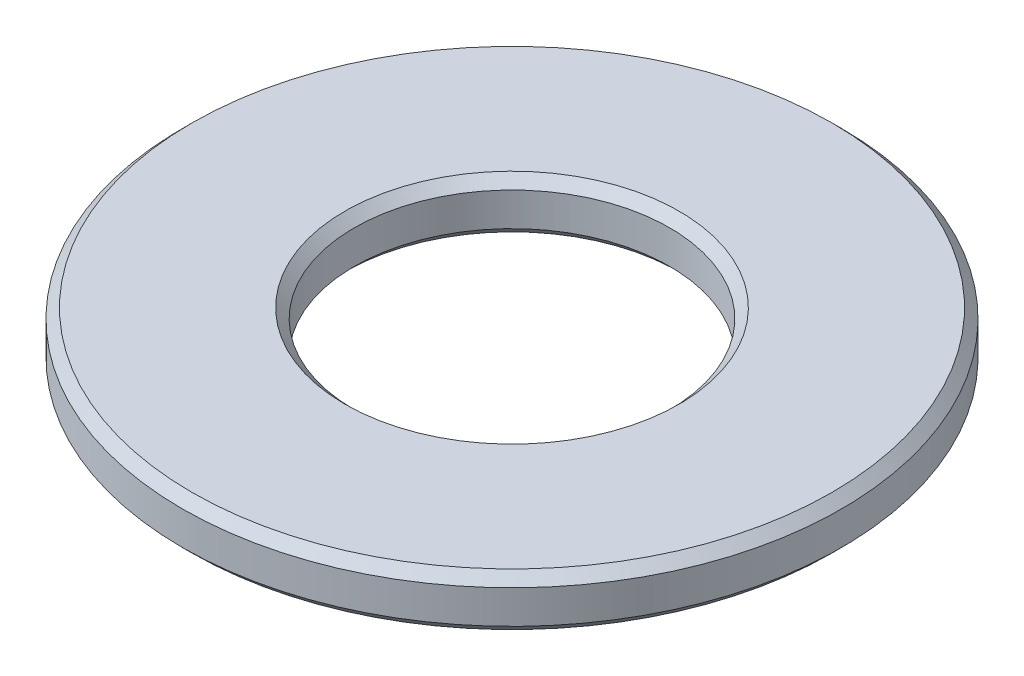
ISO-10303-21;
HEADER;
FILE_DESCRIPTION(('STEP AP214'),'2;1');
FILE_NAME('part.step','',(''),(''),'','','');
FILE_SCHEMA(('AUTOMOTIVE_DESIGN { 1 0 10303 214 1 1 1 1 }'));
ENDSEC;
DATA;
#1=APPLICATION_CONTEXT('core data for automotive mechanical design processes');
#2=APPLICATION_PROTOCOL_DEFINITION('international standard','automotive_design',2000,#1);
#3=PRODUCT_CONTEXT('',#1,'mechanical');
#4=PRODUCT('Part','Part','',(#3));
#5=PRODUCT_RELATED_PRODUCT_CATEGORY('part','',(#4));
#6=PRODUCT_DEFINITION_FORMATION('','',#4);
#7=PRODUCT_DEFINITION_CONTEXT('part definition',#1,'design');
#8=PRODUCT_DEFINITION('design','',#6,#7);
#9=PRODUCT_DEFINITION_SHAPE('','',#8);
#10=(LENGTH_UNIT() NAMED_UNIT(*) SI_UNIT(.MILLI.,.METRE.));
#11=(NAMED_UNIT(*) PLANE_ANGLE_UNIT() SI_UNIT($,.RADIAN.));
#12=(NAMED_UNIT(*) SI_UNIT($,.STERADIAN.) SOLID_ANGLE_UNIT());
#13=UNCERTAINTY_MEASURE_WITH_UNIT(LENGTH_MEASURE(1.E-05),#10,'distance_accuracy_value','');
#14=(GEOMETRIC_REPRESENTATION_CONTEXT(3) GLOBAL_UNCERTAINTY_ASSIGNED_CONTEXT((#13)) GLOBAL_UNIT_ASSIGNED_CONTEXT((#10,
#11,#12)) REPRESENTATION_CONTEXT('',''));
#15=CARTESIAN_POINT('',(0.,0.,0.));
#16=DIRECTION('',(0.,0.,1.));
#17=DIRECTION('',(1.,0.,0.));
#18=AXIS2_PLACEMENT_3D('',#15,#16,#17);
#19=CARTESIAN_POINT('',(0.,0.55,0.));
#20=DIRECTION('',(0.,1.,0.));
#21=DIRECTION('',(0.,0.,1.));
#22=AXIS2_PLACEMENT_3D('',#19,#20,#21);
#23=PLANE('',#22);
#24=CARTESIAN_POINT('',(0.,0.55,0.));
#25=DIRECTION('',(0.,1.,0.));
#26=DIRECTION('',(0.,0.,1.));
#27=AXIS2_PLACEMENT_3D('',#24,#25,#26);
#28=CIRCLE('',#27,3.35);
#29=CARTESIAN_POINT('',(0.,0.55,3.35));
#30=VERTEX_POINT('',#29);
#31=EDGE_CURVE('E58',#30,#30,#28,.T.);
#32=ORIENTED_EDGE('',*,*,#31,.T.);
#33=EDGE_LOOP('',(#32));
#34=FACE_BOUND('',#33,.T.);
#35=CARTESIAN_POINT('',(0.,0.55,0.));
#36=DIRECTION('',(0.,1.,0.));
#37=DIRECTION('',(0.,0.,1.));
#38=AXIS2_PLACEMENT_3D('',#35,#36,#37);
#39=CIRCLE('',#38,1.75);
#40=CARTESIAN_POINT('',(0.,0.55,1.75));
#41=VERTEX_POINT('',#40);
#42=EDGE_CURVE('E61',#41,#41,#39,.F.);
#43=ORIENTED_EDGE('',*,*,#42,.T.);
#44=EDGE_LOOP('',(#43));
#45=FACE_BOUND('',#44,.T.);
#46=ADVANCED_FACE('F32',(#34,#45),#23,.T.);
#47=CARTESIAN_POINT('',(0.,0.,0.));
#48=DIRECTION('',(0.,1.,0.));
#49=DIRECTION('',(0.,0.,1.));
#50=AXIS2_PLACEMENT_3D('',#47,#48,#49);
#51=PLANE('',#50);
#52=CARTESIAN_POINT('',(0.,0.,0.));
#53=DIRECTION('',(0.,1.,0.));
#54=DIRECTION('',(0.,0.,1.));
#55=AXIS2_PLACEMENT_3D('',#52,#53,#54);
#56=CIRCLE('',#55,3.35);
#57=CARTESIAN_POINT('',(0.,0.,3.35));
#58=VERTEX_POINT('',#57);
#59=EDGE_CURVE('E43',#58,#58,#56,.F.);
#60=ORIENTED_EDGE('',*,*,#59,.T.);
#61=EDGE_LOOP('',(#60));
#62=FACE_BOUND('',#61,.T.);
#63=CARTESIAN_POINT('',(0.,0.,0.));
#64=DIRECTION('',(0.,1.,0.));
#65=DIRECTION('',(0.,0.,1.));
#66=AXIS2_PLACEMENT_3D('',#63,#64,#65);
#67=CIRCLE('',#66,1.75);
#68=CARTESIAN_POINT('',(0.,0.,1.75));
#69=VERTEX_POINT('',#68);
#70=EDGE_CURVE('E47',#69,#69,#67,.T.);
#71=ORIENTED_EDGE('',*,*,#70,.T.);
#72=EDGE_LOOP('',(#71));
#73=FACE_BOUND('',#72,.T.);
#74=ADVANCED_FACE('F79',(#62,#73),#51,.F.);
#75=CARTESIAN_POINT('',(0.,0.55,0.));
#76=DIRECTION('',(0.,-1.,0.));
#77=DIRECTION('',(0.,0.,-1.));
#78=AXIS2_PLACEMENT_3D('',#75,#76,#77);
#79=CYLINDRICAL_SURFACE('',#78,3.45);
#80=CARTESIAN_POINT('',(0.,0.45,0.));
#81=DIRECTION('',(0.,1.,0.));
#82=DIRECTION('',(0.,0.,1.));
#83=AXIS2_PLACEMENT_3D('',#80,#81,#82);
#84=CIRCLE('',#83,3.45);
#85=CARTESIAN_POINT('',(0.,0.45,3.45));
#86=VERTEX_POINT('',#85);
#87=EDGE_CURVE('E52',#86,#86,#84,.F.);
#88=ORIENTED_EDGE('',*,*,#87,.T.);
#89=EDGE_LOOP('',(#88));
#90=FACE_BOUND('',#89,.T.);
#91=CARTESIAN_POINT('',(0.,0.0999999999999985,0.));
#92=DIRECTION('',(0.,1.,0.));
#93=DIRECTION('',(0.,0.,1.));
#94=AXIS2_PLACEMENT_3D('',#91,#92,#93);
#95=CIRCLE('',#94,3.45);
#96=CARTESIAN_POINT('',(0.,0.0999999999999985,3.45));
#97=VERTEX_POINT('',#96);
#98=EDGE_CURVE('E55',#97,#97,#95,.T.);
#99=ORIENTED_EDGE('',*,*,#98,.T.);
#100=EDGE_LOOP('',(#99));
#101=FACE_BOUND('',#100,.T.);
#102=ADVANCED_FACE('F85',(#90,#101),#79,.T.);
#103=CARTESIAN_POINT('',(0.,0.55,0.));
#104=DIRECTION('',(0.,-1.,0.));
#105=DIRECTION('',(0.,0.,-1.));
#106=AXIS2_PLACEMENT_3D('',#103,#104,#105);
#107=CYLINDRICAL_SURFACE('',#106,1.65);
#108=CARTESIAN_POINT('',(0.,0.45,0.));
#109=DIRECTION('',(0.,1.,0.));
#110=DIRECTION('',(0.,0.,1.));
#111=AXIS2_PLACEMENT_3D('',#108,#109,#110);
#112=CIRCLE('',#111,1.65);
#113=CARTESIAN_POINT('',(0.,0.45,1.65));
#114=VERTEX_POINT('',#113);
#115=EDGE_CURVE('E10',#114,#114,#112,.T.);
#116=ORIENTED_EDGE('',*,*,#115,.T.);
#117=EDGE_LOOP('',(#116));
#118=FACE_BOUND('',#117,.T.);
#119=CARTESIAN_POINT('',(0.,0.1,0.));
#120=DIRECTION('',(0.,1.,0.));
#121=DIRECTION('',(0.,0.,1.));
#122=AXIS2_PLACEMENT_3D('',#119,#120,#121);
#123=CIRCLE('',#122,1.65);
#124=CARTESIAN_POINT('',(0.,0.1,1.65));
#125=VERTEX_POINT('',#124);
#126=EDGE_CURVE('E39',#125,#125,#123,.F.);
#127=ORIENTED_EDGE('',*,*,#126,.T.);
#128=EDGE_LOOP('',(#127));
#129=FACE_BOUND('',#128,.T.);
#130=ADVANCED_FACE('F89',(#118,#129),#107,.F.);
#131=CARTESIAN_POINT('',(0.,0.55,0.));
#132=DIRECTION('',(0.,-1.,0.));
#133=DIRECTION('',(0.,0.,-1.));
#134=AXIS2_PLACEMENT_3D('',#131,#132,#133);
#135=CONICAL_SURFACE('',#134,3.35,0.785398163397435);
#136=ORIENTED_EDGE('',*,*,#87,.F.);
#137=EDGE_LOOP('',(#136));
#138=FACE_BOUND('',#137,.T.);
#139=ORIENTED_EDGE('',*,*,#31,.F.);
#140=EDGE_LOOP('',(#139));
#141=FACE_BOUND('',#140,.T.);
#142=ADVANCED_FACE('F75',(#138,#141),#135,.T.);
#143=CARTESIAN_POINT('',(0.,0.0999999999999985,0.));
#144=DIRECTION('',(0.,1.,0.));
#145=DIRECTION('',(0.,0.,1.));
#146=AXIS2_PLACEMENT_3D('',#143,#144,#145);
#147=CONICAL_SURFACE('',#146,3.45,0.78539816339745);
#148=ORIENTED_EDGE('',*,*,#59,.F.);
#149=EDGE_LOOP('',(#148));
#150=FACE_BOUND('',#149,.T.);
#151=ORIENTED_EDGE('',*,*,#98,.F.);
#152=EDGE_LOOP('',(#151));
#153=FACE_BOUND('',#152,.T.);
#154=ADVANCED_FACE('F69',(#150,#153),#147,.T.);
#155=CARTESIAN_POINT('',(0.,0.45,0.));
#156=DIRECTION('',(0.,1.,0.));
#157=DIRECTION('',(0.,0.,1.));
#158=AXIS2_PLACEMENT_3D('',#155,#156,#157);
#159=CONICAL_SURFACE('',#158,1.65,0.785398163397453);
#160=CARTESIAN_POINT('',(0.,0.55,1.75));
#161=CARTESIAN_POINT('',(0.,0.548958333333333,1.74895833333333));
#162=CARTESIAN_POINT('',(0.,0.547916666666667,1.74791666666667));
#163=CARTESIAN_POINT('',(0.,0.545833333333333,1.74583333333333));
#164=CARTESIAN_POINT('',(0.,0.544791666666667,1.74479166666667));
#165=CARTESIAN_POINT('',(0.,0.542708333333333,1.74270833333333));
#166=CARTESIAN_POINT('',(0.,0.541666666666667,1.74166666666667));
#167=CARTESIAN_POINT('',(0.,0.539583333333333,1.73958333333333));
#168=CARTESIAN_POINT('',(0.,0.538541666666667,1.73854166666667));
#169=CARTESIAN_POINT('',(0.,0.536458333333333,1.73645833333333));
#170=CARTESIAN_POINT('',(0.,0.535416666666667,1.73541666666667));
#171=CARTESIAN_POINT('',(0.,0.533333333333333,1.73333333333333));
#172=CARTESIAN_POINT('',(0.,0.532291666666667,1.73229166666667));
#173=CARTESIAN_POINT('',(0.,0.530208333333333,1.73020833333333));
#174=CARTESIAN_POINT('',(0.,0.529166666666667,1.72916666666667));
#175=CARTESIAN_POINT('',(0.,0.527083333333333,1.72708333333333));
#176=CARTESIAN_POINT('',(0.,0.526041666666667,1.72604166666667));
#177=CARTESIAN_POINT('',(0.,0.523958333333333,1.72395833333333));
#178=CARTESIAN_POINT('',(0.,0.522916666666667,1.72291666666667));
#179=CARTESIAN_POINT('',(0.,0.520833333333333,1.72083333333333));
#180=CARTESIAN_POINT('',(0.,0.519791666666667,1.71979166666667));
#181=CARTESIAN_POINT('',(0.,0.517708333333333,1.71770833333333));
#182=CARTESIAN_POINT('',(0.,0.516666666666667,1.71666666666667));
#183=CARTESIAN_POINT('',(0.,0.514583333333333,1.71458333333333));
#184=CARTESIAN_POINT('',(0.,0.513541666666667,1.71354166666667));
#185=CARTESIAN_POINT('',(0.,0.511458333333333,1.71145833333333));
#186=CARTESIAN_POINT('',(0.,0.510416666666667,1.71041666666667));
#187=CARTESIAN_POINT('',(0.,0.508333333333333,1.70833333333333));
#188=CARTESIAN_POINT('',(0.,0.507291666666667,1.70729166666667));
#189=CARTESIAN_POINT('',(0.,0.505208333333333,1.70520833333333));
#190=CARTESIAN_POINT('',(0.,0.504166666666667,1.70416666666667));
#191=CARTESIAN_POINT('',(0.,0.502083333333333,1.70208333333333));
#192=CARTESIAN_POINT('',(0.,0.501041666666667,1.70104166666667));
#193=CARTESIAN_POINT('',(0.,0.498958333333333,1.69895833333333));
#194=CARTESIAN_POINT('',(0.,0.497916666666667,1.69791666666667));
#195=CARTESIAN_POINT('',(0.,0.495833333333333,1.69583333333333));
#196=CARTESIAN_POINT('',(0.,0.494791666666667,1.69479166666667));
#197=CARTESIAN_POINT('',(0.,0.492708333333333,1.69270833333333));
#198=CARTESIAN_POINT('',(0.,0.491666666666667,1.69166666666667));
#199=CARTESIAN_POINT('',(0.,0.489583333333333,1.68958333333333));
#200=CARTESIAN_POINT('',(0.,0.488541666666667,1.68854166666667));
#201=CARTESIAN_POINT('',(0.,0.486458333333333,1.68645833333333));
#202=CARTESIAN_POINT('',(0.,0.485416666666667,1.68541666666667));
#203=CARTESIAN_POINT('',(0.,0.483333333333333,1.68333333333333));
#204=CARTESIAN_POINT('',(0.,0.482291666666667,1.68229166666667));
#205=CARTESIAN_POINT('',(0.,0.480208333333333,1.68020833333333));
#206=CARTESIAN_POINT('',(0.,0.479166666666667,1.67916666666667));
#207=CARTESIAN_POINT('',(0.,0.477083333333333,1.67708333333333));
#208=CARTESIAN_POINT('',(0.,0.476041666666667,1.67604166666667));
#209=CARTESIAN_POINT('',(0.,0.473958333333333,1.67395833333333));
#210=CARTESIAN_POINT('',(0.,0.472916666666667,1.67291666666667));
#211=CARTESIAN_POINT('',(0.,0.470833333333333,1.67083333333333));
#212=CARTESIAN_POINT('',(0.,0.469791666666667,1.66979166666667));
#213=CARTESIAN_POINT('',(0.,0.467708333333334,1.66770833333333));
#214=CARTESIAN_POINT('',(0.,0.466666666666667,1.66666666666667));
#215=CARTESIAN_POINT('',(0.,0.464583333333334,1.66458333333333));
#216=CARTESIAN_POINT('',(0.,0.463541666666667,1.66354166666667));
#217=CARTESIAN_POINT('',(0.,0.461458333333333,1.66145833333333));
#218=CARTESIAN_POINT('',(0.,0.460416666666667,1.66041666666667));
#219=CARTESIAN_POINT('',(0.,0.458333333333333,1.65833333333333));
#220=CARTESIAN_POINT('',(0.,0.457291666666667,1.65729166666667));
#221=CARTESIAN_POINT('',(0.,0.455208333333333,1.65520833333333));
#222=CARTESIAN_POINT('',(0.,0.454166666666667,1.65416666666667));
#223=CARTESIAN_POINT('',(0.,0.452083333333333,1.65208333333333));
#224=CARTESIAN_POINT('',(0.,0.451041666666667,1.65104166666667));
#225=CARTESIAN_POINT('',(0.,0.45,1.65));
#226=B_SPLINE_CURVE_WITH_KNOTS('',3,(#160,#161,#162,#163,#164,#165,#166,#167,#168,#169,#170,
#171,#172,#173,#174,#175,#176,#177,#178,#179,#180,#181,#182,#183,#184,#185,#186,#187,#188,#189,
#190,#191,#192,#193,#194,#195,#196,#197,#198,#199,#200,#201,#202,#203,#204,#205,#206,#207,#208,
#209,#210,#211,#212,#213,#214,#215,#216,#217,#218,#219,#220,#221,#222,#223,#224,#225),
.UNSPECIFIED.,.F.,.F.,(4,2,2,2,2,2,2,2,2,2,2,2,2,2,2,2,2,2,2,2,2,2,2,2,2,2,2,2,2,2,2,2,4),(0.,
0.00441941738241597,0.00883883476483187,0.0132582521472478,0.0176776695296638,
0.0220970869120796,0.0265165042944956,0.0309359216769116,0.0353553390593275,0.0397747564417434,
0.0441941738241594,0.0486135912065754,0.0530330085889912,0.0574524259714072,0.0618718433538231,
0.066291260736239,0.0707106781186549,0.0751300955010709,0.0795495128834868,0.0839689302659028,
0.0883883476483187,0.0928077650307347,0.0972271824131505,0.101646599795566,0.106066017177983,
0.110485434560398,0.114904851942814,0.11932426932523,0.123743686707646,0.128163104090062,
0.132582521472478,0.137001938854894,0.14142135623731),.UNSPECIFIED.);
#227=EDGE_CURVE('BSEAM66',#41,#114,#226,.T.);
#228=ORIENTED_EDGE('',*,*,#42,.F.);
#229=ORIENTED_EDGE('',*,*,#115,.F.);
#230=ORIENTED_EDGE('',*,*,#227,.T.);
#231=ORIENTED_EDGE('',*,*,#227,.F.);
#232=EDGE_LOOP('',(#228,#230,#229,#231));
#233=FACE_BOUND('',#232,.T.);
#234=ADVANCED_FACE('F66',(#233),#159,.F.);
#235=CARTESIAN_POINT('',(0.,0.,0.));
#236=DIRECTION('',(0.,-1.,0.));
#237=DIRECTION('',(0.,0.,-1.));
#238=AXIS2_PLACEMENT_3D('',#235,#236,#237);
#239=CONICAL_SURFACE('',#238,1.75,0.78539816339744);
#240=ORIENTED_EDGE('',*,*,#126,.F.);
#241=EDGE_LOOP('',(#240));
#242=FACE_BOUND('',#241,.T.);
#243=ORIENTED_EDGE('',*,*,#70,.F.);
#244=EDGE_LOOP('',(#243));
#245=FACE_BOUND('',#244,.T.);
#246=ADVANCED_FACE('F34',(#242,#245),#239,.F.);
#247=CLOSED_SHELL('',(#46,#74,#102,#130,#142,#154,#234,#246));
#248=MANIFOLD_SOLID_BREP('B2',#247);
#249=ADVANCED_BREP_SHAPE_REPRESENTATION('',(#18,#248),#14);
#250=SHAPE_DEFINITION_REPRESENTATION(#9,#249);
ENDSEC;
END-ISO-10303-21;
